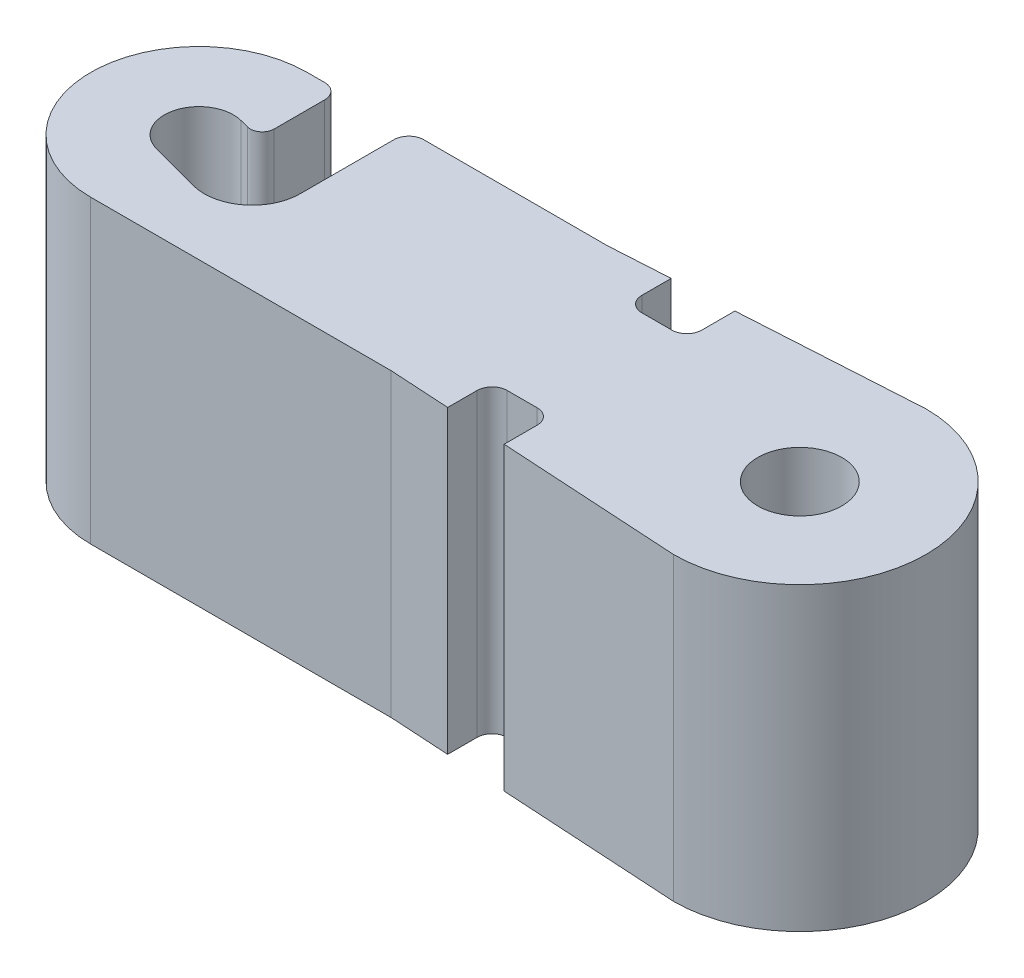
ISO-10303-21;
HEADER;
FILE_DESCRIPTION(('STEP AP214'),'2;1');
FILE_NAME('part.step','',(''),(''),'','','');
FILE_SCHEMA(('AUTOMOTIVE_DESIGN { 1 0 10303 214 1 1 1 1 }'));
ENDSEC;
DATA;
#1=APPLICATION_CONTEXT('core data for automotive mechanical design processes');
#2=APPLICATION_PROTOCOL_DEFINITION('international standard','automotive_design',2000,#1);
#3=PRODUCT_CONTEXT('',#1,'mechanical');
#4=PRODUCT('Part','Part','',(#3));
#5=PRODUCT_RELATED_PRODUCT_CATEGORY('part','',(#4));
#6=PRODUCT_DEFINITION_FORMATION('','',#4);
#7=PRODUCT_DEFINITION_CONTEXT('part definition',#1,'design');
#8=PRODUCT_DEFINITION('design','',#6,#7);
#9=PRODUCT_DEFINITION_SHAPE('','',#8);
#10=(LENGTH_UNIT() NAMED_UNIT(*) SI_UNIT(.MILLI.,.METRE.));
#11=(NAMED_UNIT(*) PLANE_ANGLE_UNIT() SI_UNIT($,.RADIAN.));
#12=(NAMED_UNIT(*) SI_UNIT($,.STERADIAN.) SOLID_ANGLE_UNIT());
#13=UNCERTAINTY_MEASURE_WITH_UNIT(LENGTH_MEASURE(1.E-05),#10,'distance_accuracy_value','');
#14=(GEOMETRIC_REPRESENTATION_CONTEXT(3) GLOBAL_UNCERTAINTY_ASSIGNED_CONTEXT((#13)) GLOBAL_UNIT_ASSIGNED_CONTEXT((#10,
#11,#12)) REPRESENTATION_CONTEXT('',''));
#15=CARTESIAN_POINT('',(0.,0.,0.));
#16=DIRECTION('',(0.,0.,1.));
#17=DIRECTION('',(1.,0.,0.));
#18=AXIS2_PLACEMENT_3D('',#15,#16,#17);
#19=CARTESIAN_POINT('',(-2.50000000000002,2.5,-0.9));
#20=DIRECTION('',(0.,0.,1.));
#21=DIRECTION('',(1.,0.,0.));
#22=AXIS2_PLACEMENT_3D('',#19,#20,#21);
#23=PLANE('',#22);
#24=DIRECTION('',(-1.,0.,0.));
#25=VECTOR('',#24,1.);
#26=CARTESIAN_POINT('',(-2.50000000000002,2.5,-0.9));
#27=LINE('',#26,#25);
#28=CARTESIAN_POINT('',(-4.85337914702339,2.5,-0.9));
#29=VERTEX_POINT('',#28);
#30=CARTESIAN_POINT('',(-5.,2.5,-0.9));
#31=VERTEX_POINT('',#30);
#32=EDGE_CURVE('E302',#29,#31,#27,.T.);
#33=ORIENTED_EDGE('',*,*,#32,.F.);
#34=DIRECTION('',(0.,1.,0.));
#35=VECTOR('',#34,1.);
#36=CARTESIAN_POINT('',(-4.85337914702339,2.5,-0.9));
#37=LINE('',#36,#35);
#38=CARTESIAN_POINT('',(-4.85337914702339,0.,-0.9));
#39=VERTEX_POINT('',#38);
#40=EDGE_CURVE('E378',#29,#39,#37,.F.);
#41=ORIENTED_EDGE('',*,*,#40,.T.);
#42=DIRECTION('',(-1.,0.,0.));
#43=VECTOR('',#42,1.);
#44=CARTESIAN_POINT('',(-2.50000000000002,0.,-0.9));
#45=LINE('',#44,#43);
#46=CARTESIAN_POINT('',(-5.,0.,-0.9));
#47=VERTEX_POINT('',#46);
#48=EDGE_CURVE('E345',#39,#47,#45,.T.);
#49=ORIENTED_EDGE('',*,*,#48,.T.);
#50=DIRECTION('',(0.,-1.,0.));
#51=VECTOR('',#50,1.);
#52=CARTESIAN_POINT('',(-5.,2.5,-0.9));
#53=LINE('',#52,#51);
#54=EDGE_CURVE('E351',#31,#47,#53,.T.);
#55=ORIENTED_EDGE('',*,*,#54,.F.);
#56=EDGE_LOOP('',(#33,#41,#49,#55));
#57=FACE_BOUND('',#56,.T.);
#58=ADVANCED_FACE('F35',(#57),#23,.F.);
#59=CARTESIAN_POINT('',(-2.50000000000002,2.5,-0.9));
#60=DIRECTION('',(-0.0598922907279451,0.,-0.998204845465779));
#61=DIRECTION('',(-0.998204845465779,0.,0.0598922907279451));
#62=AXIS2_PLACEMENT_3D('',#59,#60,#61);
#63=PLANE('',#62);
#64=DIRECTION('',(0.998204845465779,0.,-0.0598922907279451));
#65=VECTOR('',#64,1.);
#66=CARTESIAN_POINT('',(-2.50000000000002,0.,-0.9));
#67=LINE('',#66,#65);
#68=CARTESIAN_POINT('',(-2.50000000000002,0.,-0.9));
#69=VERTEX_POINT('',#68);
#70=CARTESIAN_POINT('',(-2.,0.,-0.93));
#71=VERTEX_POINT('',#70);
#72=EDGE_CURVE('E307',#69,#71,#67,.T.);
#73=ORIENTED_EDGE('',*,*,#72,.F.);
#74=DIRECTION('',(0.,-1.,0.));
#75=VECTOR('',#74,1.);
#76=CARTESIAN_POINT('',(-2.50000000000002,2.5,-0.9));
#77=LINE('',#76,#75);
#78=CARTESIAN_POINT('',(-2.50000000000002,2.5,-0.9));
#79=VERTEX_POINT('',#78);
#80=EDGE_CURVE('E348',#79,#69,#77,.T.);
#81=ORIENTED_EDGE('',*,*,#80,.F.);
#82=DIRECTION('',(0.998204845465779,0.,-0.0598922907279451));
#83=VECTOR('',#82,1.);
#84=CARTESIAN_POINT('',(-2.50000000000002,2.5,-0.9));
#85=LINE('',#84,#83);
#86=CARTESIAN_POINT('',(-2.,2.5,-0.93));
#87=VERTEX_POINT('',#86);
#88=EDGE_CURVE('E265',#79,#87,#85,.T.);
#89=ORIENTED_EDGE('',*,*,#88,.T.);
#90=DIRECTION('',(0.,-1.,0.));
#91=VECTOR('',#90,1.);
#92=CARTESIAN_POINT('',(-2.,2.5,-0.93));
#93=LINE('',#92,#91);
#94=EDGE_CURVE('E306',#87,#71,#93,.T.);
#95=ORIENTED_EDGE('',*,*,#94,.T.);
#96=EDGE_LOOP('',(#73,#81,#89,#95));
#97=FACE_BOUND('',#96,.T.);
#98=ADVANCED_FACE('F462',(#97),#63,.T.);
#99=CARTESIAN_POINT('',(-4.02837914702339,0.,-0.9));
#100=VERTEX_POINT('',#99);
#101=EDGE_CURVE('E269',#69,#100,#45,.T.);
#102=ORIENTED_EDGE('',*,*,#101,.T.);
#103=DIRECTION('',(0.,1.,0.));
#104=VECTOR('',#103,1.);
#105=CARTESIAN_POINT('',(-4.02837914702339,2.5,-0.9));
#106=LINE('',#105,#104);
#107=CARTESIAN_POINT('',(-4.02837914702339,2.5,-0.9));
#108=VERTEX_POINT('',#107);
#109=EDGE_CURVE('E384',#100,#108,#106,.T.);
#110=ORIENTED_EDGE('',*,*,#109,.T.);
#111=EDGE_CURVE('E303',#79,#108,#27,.T.);
#112=ORIENTED_EDGE('',*,*,#111,.F.);
#113=ORIENTED_EDGE('',*,*,#80,.T.);
#114=EDGE_LOOP('',(#102,#110,#112,#113));
#115=FACE_BOUND('',#114,.T.);
#116=ADVANCED_FACE('F458',(#115),#23,.F.);
#117=CARTESIAN_POINT('',(-5.,2.5,0.));
#118=DIRECTION('',(0.,-1.,0.));
#119=DIRECTION('',(0.,0.,-1.));
#120=AXIS2_PLACEMENT_3D('',#117,#118,#119);
#121=CYLINDRICAL_SURFACE('',#120,0.9);
#122=CARTESIAN_POINT('',(-5.,0.,0.));
#123=DIRECTION('',(0.,1.,0.));
#124=DIRECTION('',(0.,0.,1.));
#125=AXIS2_PLACEMENT_3D('',#122,#123,#124);
#126=CIRCLE('',#125,0.9);
#127=CARTESIAN_POINT('',(-5.,0.,0.9));
#128=VERTEX_POINT('',#127);
#129=EDGE_CURVE('E342',#47,#128,#126,.T.);
#130=ORIENTED_EDGE('',*,*,#129,.T.);
#131=DIRECTION('',(0.,-1.,0.));
#132=VECTOR('',#131,1.);
#133=CARTESIAN_POINT('',(-5.,2.5,0.9));
#134=LINE('',#133,#132);
#135=CARTESIAN_POINT('',(-5.,2.5,0.9));
#136=VERTEX_POINT('',#135);
#137=EDGE_CURVE('E354',#136,#128,#134,.T.);
#138=ORIENTED_EDGE('',*,*,#137,.F.);
#139=CARTESIAN_POINT('',(-5.,2.5,0.));
#140=DIRECTION('',(0.,1.,0.));
#141=DIRECTION('',(0.,0.,1.));
#142=AXIS2_PLACEMENT_3D('',#139,#140,#141);
#143=CIRCLE('',#142,0.9);
#144=EDGE_CURVE('E300',#31,#136,#143,.T.);
#145=ORIENTED_EDGE('',*,*,#144,.F.);
#146=ORIENTED_EDGE('',*,*,#54,.T.);
#147=EDGE_LOOP('',(#130,#138,#145,#146));
#148=FACE_BOUND('',#147,.T.);
#149=ADVANCED_FACE('F533',(#148),#121,.T.);
#150=CARTESIAN_POINT('',(-2.50000000000002,2.5,0.9));
#151=DIRECTION('',(0.,0.,1.));
#152=DIRECTION('',(1.,0.,0.));
#153=AXIS2_PLACEMENT_3D('',#150,#151,#152);
#154=PLANE('',#153);
#155=DIRECTION('',(-1.,0.,0.));
#156=VECTOR('',#155,1.);
#157=CARTESIAN_POINT('',(-2.50000000000002,0.,0.9));
#158=LINE('',#157,#156);
#159=CARTESIAN_POINT('',(-2.50000000000002,0.,0.9));
#160=VERTEX_POINT('',#159);
#161=EDGE_CURVE('E339',#160,#128,#158,.T.);
#162=ORIENTED_EDGE('',*,*,#161,.F.);
#163=DIRECTION('',(0.,-1.,0.));
#164=VECTOR('',#163,1.);
#165=CARTESIAN_POINT('',(-2.50000000000002,2.5,0.9));
#166=LINE('',#165,#164);
#167=CARTESIAN_POINT('',(-2.50000000000002,2.5,0.9));
#168=VERTEX_POINT('',#167);
#169=EDGE_CURVE('E356',#168,#160,#166,.T.);
#170=ORIENTED_EDGE('',*,*,#169,.F.);
#171=DIRECTION('',(-1.,0.,0.));
#172=VECTOR('',#171,1.);
#173=CARTESIAN_POINT('',(-2.50000000000002,2.5,0.9));
#174=LINE('',#173,#172);
#175=EDGE_CURVE('E297',#168,#136,#174,.T.);
#176=ORIENTED_EDGE('',*,*,#175,.T.);
#177=ORIENTED_EDGE('',*,*,#137,.T.);
#178=EDGE_LOOP('',(#162,#170,#176,#177));
#179=FACE_BOUND('',#178,.T.);
#180=ADVANCED_FACE('F529',(#179),#154,.T.);
#181=CARTESIAN_POINT('',(-2.50000000000002,2.5,0.9));
#182=DIRECTION('',(0.0598922907279451,0.,-0.998204845465779));
#183=DIRECTION('',(-0.998204845465779,0.,-0.0598922907279451));
#184=AXIS2_PLACEMENT_3D('',#181,#182,#183);
#185=PLANE('',#184);
#186=DIRECTION('',(0.998204845465779,0.,0.0598922907279451));
#187=VECTOR('',#186,1.);
#188=CARTESIAN_POINT('',(-2.50000000000002,0.,0.9));
#189=LINE('',#188,#187);
#190=CARTESIAN_POINT('',(-2.,0.,0.93));
#191=VERTEX_POINT('',#190);
#192=EDGE_CURVE('E337',#160,#191,#189,.T.);
#193=ORIENTED_EDGE('',*,*,#192,.T.);
#194=DIRECTION('',(0.,-1.,0.));
#195=VECTOR('',#194,1.);
#196=CARTESIAN_POINT('',(-2.,2.5,0.93));
#197=LINE('',#196,#195);
#198=CARTESIAN_POINT('',(-2.,2.5,0.93));
#199=VERTEX_POINT('',#198);
#200=EDGE_CURVE('E358',#199,#191,#197,.T.);
#201=ORIENTED_EDGE('',*,*,#200,.F.);
#202=DIRECTION('',(0.998204845465779,0.,0.0598922907279451));
#203=VECTOR('',#202,1.);
#204=CARTESIAN_POINT('',(-2.50000000000002,2.5,0.9));
#205=LINE('',#204,#203);
#206=EDGE_CURVE('E295',#168,#199,#205,.T.);
#207=ORIENTED_EDGE('',*,*,#206,.F.);
#208=ORIENTED_EDGE('',*,*,#169,.T.);
#209=EDGE_LOOP('',(#193,#201,#207,#208));
#210=FACE_BOUND('',#209,.T.);
#211=ADVANCED_FACE('F524',(#210),#185,.F.);
#212=CARTESIAN_POINT('',(-2.,2.5,0.93));
#213=DIRECTION('',(-1.,0.,0.));
#214=DIRECTION('',(0.,0.,1.));
#215=AXIS2_PLACEMENT_3D('',#212,#213,#214);
#216=PLANE('',#215);
#217=DIRECTION('',(0.,0.,-1.));
#218=VECTOR('',#217,1.);
#219=CARTESIAN_POINT('',(-2.,0.,0.93));
#220=LINE('',#219,#218);
#221=CARTESIAN_POINT('',(-2.,0.,0.685));
#222=VERTEX_POINT('',#221);
#223=EDGE_CURVE('E334',#191,#222,#220,.T.);
#224=ORIENTED_EDGE('',*,*,#223,.T.);
#225=DIRECTION('',(0.,-1.,0.));
#226=VECTOR('',#225,1.);
#227=CARTESIAN_POINT('',(-2.,2.5,0.685));
#228=LINE('',#227,#226);
#229=CARTESIAN_POINT('',(-2.,2.5,0.685));
#230=VERTEX_POINT('',#229);
#231=EDGE_CURVE('E395',#222,#230,#228,.F.);
#232=ORIENTED_EDGE('',*,*,#231,.T.);
#233=DIRECTION('',(0.,0.,-1.));
#234=VECTOR('',#233,1.);
#235=CARTESIAN_POINT('',(-2.,2.5,0.93));
#236=LINE('',#235,#234);
#237=EDGE_CURVE('E292',#199,#230,#236,.T.);
#238=ORIENTED_EDGE('',*,*,#237,.F.);
#239=ORIENTED_EDGE('',*,*,#200,.T.);
#240=EDGE_LOOP('',(#224,#232,#238,#239));
#241=FACE_BOUND('',#240,.T.);
#242=ADVANCED_FACE('F519',(#241),#216,.F.);
#243=CARTESIAN_POINT('',(-1.5,2.5,0.56));
#244=DIRECTION('',(0.,0.,1.));
#245=DIRECTION('',(1.,0.,0.));
#246=AXIS2_PLACEMENT_3D('',#243,#244,#245);
#247=PLANE('',#246);
#248=DIRECTION('',(-1.,0.,0.));
#249=VECTOR('',#248,1.);
#250=CARTESIAN_POINT('',(-1.5,2.5,0.56));
#251=LINE('',#250,#249);
#252=CARTESIAN_POINT('',(-1.625,2.5,0.56));
#253=VERTEX_POINT('',#252);
#254=CARTESIAN_POINT('',(-1.875,2.5,0.56));
#255=VERTEX_POINT('',#254);
#256=EDGE_CURVE('E289',#253,#255,#251,.T.);
#257=ORIENTED_EDGE('',*,*,#256,.T.);
#258=DIRECTION('',(0.,-1.,0.));
#259=VECTOR('',#258,1.);
#260=CARTESIAN_POINT('',(-1.875,2.5,0.56));
#261=LINE('',#260,#259);
#262=CARTESIAN_POINT('',(-1.875,0.,0.56));
#263=VERTEX_POINT('',#262);
#264=EDGE_CURVE('E392',#255,#263,#261,.T.);
#265=ORIENTED_EDGE('',*,*,#264,.T.);
#266=DIRECTION('',(-1.,0.,0.));
#267=VECTOR('',#266,1.);
#268=CARTESIAN_POINT('',(-1.5,0.,0.56));
#269=LINE('',#268,#267);
#270=CARTESIAN_POINT('',(-1.625,0.,0.56));
#271=VERTEX_POINT('',#270);
#272=EDGE_CURVE('E331',#271,#263,#269,.T.);
#273=ORIENTED_EDGE('',*,*,#272,.F.);
#274=DIRECTION('',(0.,-1.,0.));
#275=VECTOR('',#274,1.);
#276=CARTESIAN_POINT('',(-1.625,2.5,0.56));
#277=LINE('',#276,#275);
#278=EDGE_CURVE('E390',#271,#253,#277,.F.);
#279=ORIENTED_EDGE('',*,*,#278,.T.);
#280=EDGE_LOOP('',(#257,#265,#273,#279));
#281=FACE_BOUND('',#280,.T.);
#282=ADVANCED_FACE('F507',(#281),#247,.T.);
#283=CARTESIAN_POINT('',(-1.5,2.5,0.56));
#284=DIRECTION('',(1.,0.,0.));
#285=DIRECTION('',(0.,0.,-1.));
#286=AXIS2_PLACEMENT_3D('',#283,#284,#285);
#287=PLANE('',#286);
#288=DIRECTION('',(0.,0.,1.));
#289=VECTOR('',#288,1.);
#290=CARTESIAN_POINT('',(-1.5,2.5,0.56));
#291=LINE('',#290,#289);
#292=CARTESIAN_POINT('',(-1.5,2.5,0.685));
#293=VERTEX_POINT('',#292);
#294=CARTESIAN_POINT('',(-1.5,2.5,0.96));
#295=VERTEX_POINT('',#294);
#296=EDGE_CURVE('E287',#293,#295,#291,.T.);
#297=ORIENTED_EDGE('',*,*,#296,.F.);
#298=DIRECTION('',(0.,-1.,0.));
#299=VECTOR('',#298,1.);
#300=CARTESIAN_POINT('',(-1.5,2.5,0.685));
#301=LINE('',#300,#299);
#302=CARTESIAN_POINT('',(-1.5,0.,0.685));
#303=VERTEX_POINT('',#302);
#304=EDGE_CURVE('E397',#293,#303,#301,.T.);
#305=ORIENTED_EDGE('',*,*,#304,.T.);
#306=DIRECTION('',(0.,0.,1.));
#307=VECTOR('',#306,1.);
#308=CARTESIAN_POINT('',(-1.5,0.,0.56));
#309=LINE('',#308,#307);
#310=CARTESIAN_POINT('',(-1.5,0.,0.96));
#311=VERTEX_POINT('',#310);
#312=EDGE_CURVE('E329',#303,#311,#309,.T.);
#313=ORIENTED_EDGE('',*,*,#312,.T.);
#314=DIRECTION('',(0.,-1.,0.));
#315=VECTOR('',#314,1.);
#316=CARTESIAN_POINT('',(-1.5,2.5,0.96));
#317=LINE('',#316,#315);
#318=EDGE_CURVE('E361',#295,#311,#317,.T.);
#319=ORIENTED_EDGE('',*,*,#318,.F.);
#320=EDGE_LOOP('',(#297,#305,#313,#319));
#321=FACE_BOUND('',#320,.T.);
#322=ADVANCED_FACE('F501',(#321),#287,.F.);
#323=CARTESIAN_POINT('',(0.,2.5,1.05));
#324=DIRECTION('',(-0.0598922907279466,0.,0.998204845465779));
#325=DIRECTION('',(0.998204845465779,0.,0.0598922907279466));
#326=AXIS2_PLACEMENT_3D('',#323,#324,#325);
#327=PLANE('',#326);
#328=DIRECTION('',(-0.998204845465779,0.,-0.0598922907279466));
#329=VECTOR('',#328,1.);
#330=CARTESIAN_POINT('',(0.,0.,1.05));
#331=LINE('',#330,#329);
#332=CARTESIAN_POINT('',(0.,0.,1.05));
#333=VERTEX_POINT('',#332);
#334=EDGE_CURVE('E326',#333,#311,#331,.T.);
#335=ORIENTED_EDGE('',*,*,#334,.F.);
#336=DIRECTION('',(0.,-1.,0.));
#337=VECTOR('',#336,1.);
#338=CARTESIAN_POINT('',(0.,2.5,1.05));
#339=LINE('',#338,#337);
#340=CARTESIAN_POINT('',(0.,2.5,1.05));
#341=VERTEX_POINT('',#340);
#342=EDGE_CURVE('E364',#341,#333,#339,.T.);
#343=ORIENTED_EDGE('',*,*,#342,.F.);
#344=DIRECTION('',(-0.998204845465779,0.,-0.0598922907279466));
#345=VECTOR('',#344,1.);
#346=CARTESIAN_POINT('',(0.,2.5,1.05));
#347=LINE('',#346,#345);
#348=EDGE_CURVE('E284',#341,#295,#347,.T.);
#349=ORIENTED_EDGE('',*,*,#348,.T.);
#350=ORIENTED_EDGE('',*,*,#318,.T.);
#351=EDGE_LOOP('',(#335,#343,#349,#350));
#352=FACE_BOUND('',#351,.T.);
#353=ADVANCED_FACE('F497',(#352),#327,.T.);
#354=CARTESIAN_POINT('',(0.,2.5,0.));
#355=DIRECTION('',(0.,-1.,0.));
#356=DIRECTION('',(0.,0.,-1.));
#357=AXIS2_PLACEMENT_3D('',#354,#355,#356);
#358=CYLINDRICAL_SURFACE('',#357,1.05);
#359=CARTESIAN_POINT('',(0.,0.,0.));
#360=DIRECTION('',(0.,-1.,0.));
#361=DIRECTION('',(0.,0.,-1.));
#362=AXIS2_PLACEMENT_3D('',#359,#360,#361);
#363=CIRCLE('',#362,1.05);
#364=CARTESIAN_POINT('',(0.,0.,-1.05));
#365=VERTEX_POINT('',#364);
#366=EDGE_CURVE('E323',#365,#333,#363,.T.);
#367=ORIENTED_EDGE('',*,*,#366,.F.);
#368=DIRECTION('',(0.,-1.,0.));
#369=VECTOR('',#368,1.);
#370=CARTESIAN_POINT('',(0.,2.5,-1.05));
#371=LINE('',#370,#369);
#372=CARTESIAN_POINT('',(0.,2.5,-1.05));
#373=VERTEX_POINT('',#372);
#374=EDGE_CURVE('E366',#373,#365,#371,.T.);
#375=ORIENTED_EDGE('',*,*,#374,.F.);
#376=CARTESIAN_POINT('',(0.,2.5,0.));
#377=DIRECTION('',(0.,-1.,0.));
#378=DIRECTION('',(0.,0.,-1.));
#379=AXIS2_PLACEMENT_3D('',#376,#377,#378);
#380=CIRCLE('',#379,1.05);
#381=EDGE_CURVE('E281',#373,#341,#380,.T.);
#382=ORIENTED_EDGE('',*,*,#381,.T.);
#383=ORIENTED_EDGE('',*,*,#342,.T.);
#384=EDGE_LOOP('',(#367,#375,#382,#383));
#385=FACE_BOUND('',#384,.T.);
#386=ADVANCED_FACE('F493',(#385),#358,.T.);
#387=CARTESIAN_POINT('',(-1.5,2.5,-0.96));
#388=DIRECTION('',(-0.0598922907279466,0.,-0.998204845465779));
#389=DIRECTION('',(-0.998204845465779,0.,0.0598922907279466));
#390=AXIS2_PLACEMENT_3D('',#387,#388,#389);
#391=PLANE('',#390);
#392=DIRECTION('',(0.998204845465779,0.,-0.0598922907279466));
#393=VECTOR('',#392,1.);
#394=CARTESIAN_POINT('',(-1.5,0.,-0.96));
#395=LINE('',#394,#393);
#396=CARTESIAN_POINT('',(-1.5,0.,-0.96));
#397=VERTEX_POINT('',#396);
#398=EDGE_CURVE('E320',#397,#365,#395,.T.);
#399=ORIENTED_EDGE('',*,*,#398,.F.);
#400=DIRECTION('',(0.,-1.,0.));
#401=VECTOR('',#400,1.);
#402=CARTESIAN_POINT('',(-1.5,2.5,-0.96));
#403=LINE('',#402,#401);
#404=CARTESIAN_POINT('',(-1.5,2.5,-0.96));
#405=VERTEX_POINT('',#404);
#406=EDGE_CURVE('E368',#405,#397,#403,.T.);
#407=ORIENTED_EDGE('',*,*,#406,.F.);
#408=DIRECTION('',(0.998204845465779,0.,-0.0598922907279466));
#409=VECTOR('',#408,1.);
#410=CARTESIAN_POINT('',(-1.5,2.5,-0.96));
#411=LINE('',#410,#409);
#412=EDGE_CURVE('E278',#405,#373,#411,.T.);
#413=ORIENTED_EDGE('',*,*,#412,.T.);
#414=ORIENTED_EDGE('',*,*,#374,.T.);
#415=EDGE_LOOP('',(#399,#407,#413,#414));
#416=FACE_BOUND('',#415,.T.);
#417=ADVANCED_FACE('F488',(#416),#391,.T.);
#418=CARTESIAN_POINT('',(-1.5,2.5,-0.96));
#419=DIRECTION('',(1.,0.,0.));
#420=DIRECTION('',(0.,0.,-1.));
#421=AXIS2_PLACEMENT_3D('',#418,#419,#420);
#422=PLANE('',#421);
#423=DIRECTION('',(0.,0.,1.));
#424=VECTOR('',#423,1.);
#425=CARTESIAN_POINT('',(-1.5,0.,-0.96));
#426=LINE('',#425,#424);
#427=CARTESIAN_POINT('',(-1.5,0.,-0.685));
#428=VERTEX_POINT('',#427);
#429=EDGE_CURVE('E317',#397,#428,#426,.T.);
#430=ORIENTED_EDGE('',*,*,#429,.T.);
#431=DIRECTION('',(0.,-1.,0.));
#432=VECTOR('',#431,1.);
#433=CARTESIAN_POINT('',(-1.5,2.5,-0.685));
#434=LINE('',#433,#432);
#435=CARTESIAN_POINT('',(-1.5,2.5,-0.685));
#436=VERTEX_POINT('',#435);
#437=EDGE_CURVE('E405',#428,#436,#434,.F.);
#438=ORIENTED_EDGE('',*,*,#437,.T.);
#439=DIRECTION('',(0.,0.,1.));
#440=VECTOR('',#439,1.);
#441=CARTESIAN_POINT('',(-1.5,2.5,-0.96));
#442=LINE('',#441,#440);
#443=EDGE_CURVE('E275',#405,#436,#442,.T.);
#444=ORIENTED_EDGE('',*,*,#443,.F.);
#445=ORIENTED_EDGE('',*,*,#406,.T.);
#446=EDGE_LOOP('',(#430,#438,#444,#445));
#447=FACE_BOUND('',#446,.T.);
#448=ADVANCED_FACE('F486',(#447),#422,.F.);
#449=CARTESIAN_POINT('',(-2.,2.5,-0.56));
#450=DIRECTION('',(0.,0.,-1.));
#451=DIRECTION('',(-1.,0.,0.));
#452=AXIS2_PLACEMENT_3D('',#449,#450,#451);
#453=PLANE('',#452);
#454=DIRECTION('',(1.,0.,0.));
#455=VECTOR('',#454,1.);
#456=CARTESIAN_POINT('',(-2.,2.5,-0.56));
#457=LINE('',#456,#455);
#458=CARTESIAN_POINT('',(-1.875,2.5,-0.56));
#459=VERTEX_POINT('',#458);
#460=CARTESIAN_POINT('',(-1.625,2.5,-0.56));
#461=VERTEX_POINT('',#460);
#462=EDGE_CURVE('E272',#459,#461,#457,.T.);
#463=ORIENTED_EDGE('',*,*,#462,.T.);
#464=DIRECTION('',(0.,-1.,0.));
#465=VECTOR('',#464,1.);
#466=CARTESIAN_POINT('',(-1.625,2.5,-0.56));
#467=LINE('',#466,#465);
#468=CARTESIAN_POINT('',(-1.625,0.,-0.56));
#469=VERTEX_POINT('',#468);
#470=EDGE_CURVE('E402',#461,#469,#467,.T.);
#471=ORIENTED_EDGE('',*,*,#470,.T.);
#472=DIRECTION('',(1.,0.,0.));
#473=VECTOR('',#472,1.);
#474=CARTESIAN_POINT('',(-2.,0.,-0.56));
#475=LINE('',#474,#473);
#476=CARTESIAN_POINT('',(-1.875,0.,-0.56));
#477=VERTEX_POINT('',#476);
#478=EDGE_CURVE('E314',#477,#469,#475,.T.);
#479=ORIENTED_EDGE('',*,*,#478,.F.);
#480=DIRECTION('',(0.,-1.,0.));
#481=VECTOR('',#480,1.);
#482=CARTESIAN_POINT('',(-1.875,2.5,-0.56));
#483=LINE('',#482,#481);
#484=EDGE_CURVE('E400',#477,#459,#483,.F.);
#485=ORIENTED_EDGE('',*,*,#484,.T.);
#486=EDGE_LOOP('',(#463,#471,#479,#485));
#487=FACE_BOUND('',#486,.T.);
#488=ADVANCED_FACE('F475',(#487),#453,.T.);
#489=CARTESIAN_POINT('',(-2.,2.5,-0.93));
#490=DIRECTION('',(1.,0.,0.));
#491=DIRECTION('',(0.,0.,-1.));
#492=AXIS2_PLACEMENT_3D('',#489,#490,#491);
#493=PLANE('',#492);
#494=DIRECTION('',(0.,0.,1.));
#495=VECTOR('',#494,1.);
#496=CARTESIAN_POINT('',(-2.,2.5,-0.93));
#497=LINE('',#496,#495);
#498=CARTESIAN_POINT('',(-2.,2.5,-0.685));
#499=VERTEX_POINT('',#498);
#500=EDGE_CURVE('E268',#87,#499,#497,.T.);
#501=ORIENTED_EDGE('',*,*,#500,.T.);
#502=DIRECTION('',(0.,-1.,0.));
#503=VECTOR('',#502,1.);
#504=CARTESIAN_POINT('',(-2.,0.,-0.685));
#505=LINE('',#504,#503);
#506=CARTESIAN_POINT('',(-2.,0.,-0.685));
#507=VERTEX_POINT('',#506);
#508=EDGE_CURVE('E407',#499,#507,#505,.T.);
#509=ORIENTED_EDGE('',*,*,#508,.T.);
#510=DIRECTION('',(0.,0.,1.));
#511=VECTOR('',#510,1.);
#512=CARTESIAN_POINT('',(-2.,0.,-0.93));
#513=LINE('',#512,#511);
#514=EDGE_CURVE('E310',#71,#507,#513,.T.);
#515=ORIENTED_EDGE('',*,*,#514,.F.);
#516=ORIENTED_EDGE('',*,*,#94,.F.);
#517=EDGE_LOOP('',(#501,#509,#515,#516));
#518=FACE_BOUND('',#517,.T.);
#519=ADVANCED_FACE('F466',(#518),#493,.T.);
#520=CARTESIAN_POINT('',(0.,2.5,0.));
#521=DIRECTION('',(0.,-1.,0.));
#522=DIRECTION('',(0.,0.,-1.));
#523=AXIS2_PLACEMENT_3D('',#520,#521,#522);
#524=PLANE('',#523);
#525=CARTESIAN_POINT('',(0.,2.5,0.));
#526=DIRECTION('',(0.,1.,0.));
#527=DIRECTION('',(0.,0.,1.));
#528=AXIS2_PLACEMENT_3D('',#525,#526,#527);
#529=CIRCLE('',#528,0.35);
#530=CARTESIAN_POINT('',(0.,2.5,0.35));
#531=VERTEX_POINT('',#530);
#532=EDGE_CURVE('E251',#531,#531,#529,.T.);
#533=ORIENTED_EDGE('',*,*,#532,.F.);
#534=EDGE_LOOP('',(#533));
#535=FACE_BOUND('',#534,.T.);
#536=DIRECTION('',(-0.965925826289066,0.,-0.258819045102529));
#537=VECTOR('',#536,1.);
#538=CARTESIAN_POINT('',(-4.92558952453303,2.5,-0.277703675058107));
#539=LINE('',#538,#537);
#540=CARTESIAN_POINT('',(-4.85426105153365,2.5,-0.258591268320578));
#541=VERTEX_POINT('',#540);
#542=CARTESIAN_POINT('',(-4.92558952453303,2.5,-0.277703675058107));
#543=VERTEX_POINT('',#542);
#544=EDGE_CURVE('E246',#541,#543,#539,.T.);
#545=ORIENTED_EDGE('',*,*,#544,.F.);
#546=CARTESIAN_POINT('',(-4.82837914702339,2.5,-0.355183850949484));
#547=DIRECTION('',(0.,-1.,0.));
#548=DIRECTION('',(0.,0.,-1.));
#549=AXIS2_PLACEMENT_3D('',#546,#547,#548);
#550=CIRCLE('',#549,0.1);
#551=CARTESIAN_POINT('',(-4.72837914702339,2.5,-0.355183850949484));
#552=VERTEX_POINT('',#551);
#553=EDGE_CURVE('E57',#541,#552,#550,.F.);
#554=ORIENTED_EDGE('',*,*,#553,.T.);
#555=DIRECTION('',(0.,0.,1.));
#556=VECTOR('',#555,1.);
#557=CARTESIAN_POINT('',(-4.72837914702339,2.5,-0.9));
#558=LINE('',#557,#556);
#559=CARTESIAN_POINT('',(-4.72837914702339,2.5,-0.775));
#560=VERTEX_POINT('',#559);
#561=EDGE_CURVE('E248',#560,#552,#558,.T.);
#562=ORIENTED_EDGE('',*,*,#561,.F.);
#563=CARTESIAN_POINT('',(-4.85337914702339,2.5,-0.775));
#564=DIRECTION('',(0.,-1.,0.));
#565=DIRECTION('',(0.,0.,-1.));
#566=AXIS2_PLACEMENT_3D('',#563,#564,#565);
#567=CIRCLE('',#566,0.125);
#568=EDGE_CURVE('E376',#560,#29,#567,.F.);
#569=ORIENTED_EDGE('',*,*,#568,.T.);
#570=ORIENTED_EDGE('',*,*,#32,.T.);
#571=ORIENTED_EDGE('',*,*,#144,.T.);
#572=ORIENTED_EDGE('',*,*,#175,.F.);
#573=ORIENTED_EDGE('',*,*,#206,.T.);
#574=ORIENTED_EDGE('',*,*,#237,.T.);
#575=CARTESIAN_POINT('',(-1.875,2.5,0.685));
#576=DIRECTION('',(0.,-1.,0.));
#577=DIRECTION('',(0.,0.,-1.));
#578=AXIS2_PLACEMENT_3D('',#575,#576,#577);
#579=CIRCLE('',#578,0.125);
#580=EDGE_CURVE('E412',#230,#255,#579,.T.);
#581=ORIENTED_EDGE('',*,*,#580,.T.);
#582=ORIENTED_EDGE('',*,*,#256,.F.);
#583=CARTESIAN_POINT('',(-1.625,2.5,0.685));
#584=DIRECTION('',(0.,-1.,0.));
#585=DIRECTION('',(0.,0.,-1.));
#586=AXIS2_PLACEMENT_3D('',#583,#584,#585);
#587=CIRCLE('',#586,0.125);
#588=EDGE_CURVE('E416',#253,#293,#587,.T.);
#589=ORIENTED_EDGE('',*,*,#588,.T.);
#590=ORIENTED_EDGE('',*,*,#296,.T.);
#591=ORIENTED_EDGE('',*,*,#348,.F.);
#592=ORIENTED_EDGE('',*,*,#381,.F.);
#593=ORIENTED_EDGE('',*,*,#412,.F.);
#594=ORIENTED_EDGE('',*,*,#443,.T.);
#595=CARTESIAN_POINT('',(-1.625,2.5,-0.685));
#596=DIRECTION('',(0.,-1.,0.));
#597=DIRECTION('',(0.,0.,-1.));
#598=AXIS2_PLACEMENT_3D('',#595,#596,#597);
#599=CIRCLE('',#598,0.125);
#600=EDGE_CURVE('E420',#436,#461,#599,.T.);
#601=ORIENTED_EDGE('',*,*,#600,.T.);
#602=ORIENTED_EDGE('',*,*,#462,.F.);
#603=CARTESIAN_POINT('',(-1.875,2.5,-0.685));
#604=DIRECTION('',(0.,-1.,0.));
#605=DIRECTION('',(0.,0.,-1.));
#606=AXIS2_PLACEMENT_3D('',#603,#604,#605);
#607=CIRCLE('',#606,0.125);
#608=EDGE_CURVE('E424',#459,#499,#607,.T.);
#609=ORIENTED_EDGE('',*,*,#608,.T.);
#610=ORIENTED_EDGE('',*,*,#500,.F.);
#611=ORIENTED_EDGE('',*,*,#88,.F.);
#612=ORIENTED_EDGE('',*,*,#111,.T.);
#613=CARTESIAN_POINT('',(-4.02837914702339,2.5,-0.775));
#614=DIRECTION('',(0.,-1.,0.));
#615=DIRECTION('',(0.,0.,-1.));
#616=AXIS2_PLACEMENT_3D('',#613,#614,#615);
#617=CIRCLE('',#616,0.125);
#618=CARTESIAN_POINT('',(-4.15337914702339,2.5,-0.775));
#619=VERTEX_POINT('',#618);
#620=EDGE_CURVE('E373',#108,#619,#617,.F.);
#621=ORIENTED_EDGE('',*,*,#620,.T.);
#622=DIRECTION('',(0.,0.,-1.));
#623=VECTOR('',#622,1.);
#624=CARTESIAN_POINT('',(-4.15337914702339,2.5,-0.9));
#625=LINE('',#624,#623);
#626=CARTESIAN_POINT('',(-4.15337914702339,2.5,0.00320312658184973));
#627=VERTEX_POINT('',#626);
#628=EDGE_CURVE('E261',#627,#619,#625,.T.);
#629=ORIENTED_EDGE('',*,*,#628,.F.);
#630=CARTESIAN_POINT('',(-4.55337914702339,2.5,0.00320312658184994));
#631=DIRECTION('',(0.,-1.,0.));
#632=DIRECTION('',(0.,0.,-1.));
#633=AXIS2_PLACEMENT_3D('',#630,#631,#632);
#634=CIRCLE('',#633,0.4);
#635=CARTESIAN_POINT('',(-4.6569067650644,2.5,0.389573457097477));
#636=VERTEX_POINT('',#635);
#637=EDGE_CURVE('E430',#627,#636,#634,.T.);
#638=ORIENTED_EDGE('',*,*,#637,.T.);
#639=DIRECTION('',(0.965925826289066,0.,0.258819045102528));
#640=VECTOR('',#639,1.);
#641=CARTESIAN_POINT('',(-5.07441047546698,2.5,0.277703675058106));
#642=LINE('',#641,#640);
#643=CARTESIAN_POINT('',(-5.07441047546698,2.5,0.277703675058106));
#644=VERTEX_POINT('',#643);
#645=EDGE_CURVE('E259',#644,#636,#642,.T.);
#646=ORIENTED_EDGE('',*,*,#645,.F.);
#647=CARTESIAN_POINT('',(-5.,2.5,0.));
#648=DIRECTION('',(0.,1.,0.));
#649=DIRECTION('',(0.,0.,1.));
#650=AXIS2_PLACEMENT_3D('',#647,#648,#649);
#651=CIRCLE('',#650,0.2875);
#652=EDGE_CURVE('E227',#543,#644,#651,.T.);
#653=ORIENTED_EDGE('',*,*,#652,.F.);
#654=EDGE_LOOP('',(#545,#554,#562,#569,#570,#571,#572,#573,#574,#581,#582,#589,#590,#591,#592,
#593,#594,#601,#602,#609,#610,#611,#612,#621,#629,#638,#646,#653));
#655=FACE_BOUND('',#654,.T.);
#656=ADVANCED_FACE('F442',(#535,#655),#524,.F.);
#657=CARTESIAN_POINT('',(0.,0.,0.));
#658=DIRECTION('',(0.,-1.,0.));
#659=DIRECTION('',(0.,0.,-1.));
#660=AXIS2_PLACEMENT_3D('',#657,#658,#659);
#661=PLANE('',#660);
#662=CARTESIAN_POINT('',(0.,0.,0.));
#663=DIRECTION('',(0.,1.,0.));
#664=DIRECTION('',(0.,0.,1.));
#665=AXIS2_PLACEMENT_3D('',#662,#663,#664);
#666=CIRCLE('',#665,0.35);
#667=CARTESIAN_POINT('',(0.,0.,0.35));
#668=VERTEX_POINT('',#667);
#669=EDGE_CURVE('E311',#668,#668,#666,.T.);
#670=ORIENTED_EDGE('',*,*,#669,.T.);
#671=EDGE_LOOP('',(#670));
#672=FACE_BOUND('',#671,.T.);
#673=DIRECTION('',(0.,0.,1.));
#674=VECTOR('',#673,1.);
#675=CARTESIAN_POINT('',(-4.72837914702339,0.,-0.9));
#676=LINE('',#675,#674);
#677=CARTESIAN_POINT('',(-4.72837914702339,0.,-0.775));
#678=VERTEX_POINT('',#677);
#679=CARTESIAN_POINT('',(-4.72837914702339,0.,-0.355183850949484));
#680=VERTEX_POINT('',#679);
#681=EDGE_CURVE('E255',#678,#680,#676,.T.);
#682=ORIENTED_EDGE('',*,*,#681,.T.);
#683=CARTESIAN_POINT('',(-4.82837914702339,0.,-0.355183850949484));
#684=DIRECTION('',(0.,-1.,0.));
#685=DIRECTION('',(0.,0.,-1.));
#686=AXIS2_PLACEMENT_3D('',#683,#684,#685);
#687=CIRCLE('',#686,0.1);
#688=CARTESIAN_POINT('',(-4.85426105153365,0.,-0.258591268320578));
#689=VERTEX_POINT('',#688);
#690=EDGE_CURVE('E11',#680,#689,#687,.T.);
#691=ORIENTED_EDGE('',*,*,#690,.T.);
#692=DIRECTION('',(-0.965925826289066,0.,-0.258819045102529));
#693=VECTOR('',#692,1.);
#694=CARTESIAN_POINT('',(-4.92558952453303,0.,-0.277703675058107));
#695=LINE('',#694,#693);
#696=CARTESIAN_POINT('',(-4.92558952453303,0.,-0.277703675058107));
#697=VERTEX_POINT('',#696);
#698=EDGE_CURVE('E232',#689,#697,#695,.T.);
#699=ORIENTED_EDGE('',*,*,#698,.T.);
#700=CARTESIAN_POINT('',(-5.,0.,0.));
#701=DIRECTION('',(0.,1.,0.));
#702=DIRECTION('',(0.,0.,1.));
#703=AXIS2_PLACEMENT_3D('',#700,#701,#702);
#704=CIRCLE('',#703,0.2875);
#705=CARTESIAN_POINT('',(-5.07441047546698,0.,0.277703675058106));
#706=VERTEX_POINT('',#705);
#707=EDGE_CURVE('E225',#697,#706,#704,.T.);
#708=ORIENTED_EDGE('',*,*,#707,.T.);
#709=DIRECTION('',(0.965925826289066,0.,0.258819045102528));
#710=VECTOR('',#709,1.);
#711=CARTESIAN_POINT('',(-5.07441047546698,0.,0.277703675058106));
#712=LINE('',#711,#710);
#713=CARTESIAN_POINT('',(-4.6569067650644,0.,0.389573457097477));
#714=VERTEX_POINT('',#713);
#715=EDGE_CURVE('E235',#706,#714,#712,.T.);
#716=ORIENTED_EDGE('',*,*,#715,.T.);
#717=CARTESIAN_POINT('',(-4.55337914702339,0.,0.00320312658184994));
#718=DIRECTION('',(0.,-1.,0.));
#719=DIRECTION('',(0.,0.,-1.));
#720=AXIS2_PLACEMENT_3D('',#717,#718,#719);
#721=CIRCLE('',#720,0.4);
#722=CARTESIAN_POINT('',(-4.15337914702339,0.,0.00320312658184973));
#723=VERTEX_POINT('',#722);
#724=EDGE_CURVE('E432',#714,#723,#721,.F.);
#725=ORIENTED_EDGE('',*,*,#724,.T.);
#726=DIRECTION('',(0.,0.,-1.));
#727=VECTOR('',#726,1.);
#728=CARTESIAN_POINT('',(-4.15337914702339,0.,-0.9));
#729=LINE('',#728,#727);
#730=CARTESIAN_POINT('',(-4.15337914702339,0.,-0.775));
#731=VERTEX_POINT('',#730);
#732=EDGE_CURVE('E241',#723,#731,#729,.T.);
#733=ORIENTED_EDGE('',*,*,#732,.T.);
#734=CARTESIAN_POINT('',(-4.02837914702339,0.,-0.775));
#735=DIRECTION('',(0.,-1.,0.));
#736=DIRECTION('',(0.,0.,-1.));
#737=AXIS2_PLACEMENT_3D('',#734,#735,#736);
#738=CIRCLE('',#737,0.125);
#739=EDGE_CURVE('E380',#731,#100,#738,.T.);
#740=ORIENTED_EDGE('',*,*,#739,.T.);
#741=ORIENTED_EDGE('',*,*,#101,.F.);
#742=ORIENTED_EDGE('',*,*,#72,.T.);
#743=ORIENTED_EDGE('',*,*,#514,.T.);
#744=CARTESIAN_POINT('',(-1.875,0.,-0.685));
#745=DIRECTION('',(0.,-1.,0.));
#746=DIRECTION('',(0.,0.,-1.));
#747=AXIS2_PLACEMENT_3D('',#744,#745,#746);
#748=CIRCLE('',#747,0.125);
#749=EDGE_CURVE('E422',#507,#477,#748,.F.);
#750=ORIENTED_EDGE('',*,*,#749,.T.);
#751=ORIENTED_EDGE('',*,*,#478,.T.);
#752=CARTESIAN_POINT('',(-1.625,0.,-0.685));
#753=DIRECTION('',(0.,-1.,0.));
#754=DIRECTION('',(0.,0.,-1.));
#755=AXIS2_PLACEMENT_3D('',#752,#753,#754);
#756=CIRCLE('',#755,0.125);
#757=EDGE_CURVE('E418',#469,#428,#756,.F.);
#758=ORIENTED_EDGE('',*,*,#757,.T.);
#759=ORIENTED_EDGE('',*,*,#429,.F.);
#760=ORIENTED_EDGE('',*,*,#398,.T.);
#761=ORIENTED_EDGE('',*,*,#366,.T.);
#762=ORIENTED_EDGE('',*,*,#334,.T.);
#763=ORIENTED_EDGE('',*,*,#312,.F.);
#764=CARTESIAN_POINT('',(-1.625,0.,0.685));
#765=DIRECTION('',(0.,-1.,0.));
#766=DIRECTION('',(0.,0.,-1.));
#767=AXIS2_PLACEMENT_3D('',#764,#765,#766);
#768=CIRCLE('',#767,0.125);
#769=EDGE_CURVE('E414',#303,#271,#768,.F.);
#770=ORIENTED_EDGE('',*,*,#769,.T.);
#771=ORIENTED_EDGE('',*,*,#272,.T.);
#772=CARTESIAN_POINT('',(-1.875,0.,0.685));
#773=DIRECTION('',(0.,-1.,0.));
#774=DIRECTION('',(0.,0.,-1.));
#775=AXIS2_PLACEMENT_3D('',#772,#773,#774);
#776=CIRCLE('',#775,0.125);
#777=EDGE_CURVE('E410',#263,#222,#776,.F.);
#778=ORIENTED_EDGE('',*,*,#777,.T.);
#779=ORIENTED_EDGE('',*,*,#223,.F.);
#780=ORIENTED_EDGE('',*,*,#192,.F.);
#781=ORIENTED_EDGE('',*,*,#161,.T.);
#782=ORIENTED_EDGE('',*,*,#129,.F.);
#783=ORIENTED_EDGE('',*,*,#48,.F.);
#784=CARTESIAN_POINT('',(-4.85337914702339,0.,-0.775));
#785=DIRECTION('',(0.,-1.,0.));
#786=DIRECTION('',(0.,0.,-1.));
#787=AXIS2_PLACEMENT_3D('',#784,#785,#786);
#788=CIRCLE('',#787,0.125);
#789=EDGE_CURVE('E382',#39,#678,#788,.T.);
#790=ORIENTED_EDGE('',*,*,#789,.T.);
#791=EDGE_LOOP('',(#682,#691,#699,#708,#716,#725,#733,#740,#741,#742,#743,#750,#751,#758,#759,
#760,#761,#762,#763,#770,#771,#778,#779,#780,#781,#782,#783,#790));
#792=FACE_BOUND('',#791,.T.);
#793=ADVANCED_FACE('F243',(#672,#792),#661,.T.);
#794=CARTESIAN_POINT('',(-5.,0.,0.));
#795=DIRECTION('',(0.,1.,0.));
#796=DIRECTION('',(0.,0.,1.));
#797=AXIS2_PLACEMENT_3D('',#794,#795,#796);
#798=CYLINDRICAL_SURFACE('',#797,0.2875);
#799=ORIENTED_EDGE('',*,*,#652,.T.);
#800=DIRECTION('',(0.,1.,0.));
#801=VECTOR('',#800,1.);
#802=CARTESIAN_POINT('',(-5.07441047546698,0.,0.277703675058106));
#803=LINE('',#802,#801);
#804=EDGE_CURVE('E220',#706,#644,#803,.T.);
#805=ORIENTED_EDGE('',*,*,#804,.F.);
#806=ORIENTED_EDGE('',*,*,#707,.F.);
#807=DIRECTION('',(0.,1.,0.));
#808=VECTOR('',#807,1.);
#809=CARTESIAN_POINT('',(-4.92558952453303,0.,-0.277703675058107));
#810=LINE('',#809,#808);
#811=EDGE_CURVE('E231',#697,#543,#810,.T.);
#812=ORIENTED_EDGE('',*,*,#811,.T.);
#813=EDGE_LOOP('',(#799,#805,#806,#812));
#814=FACE_BOUND('',#813,.T.);
#815=ADVANCED_FACE('F222',(#814),#798,.F.);
#816=CARTESIAN_POINT('',(-4.92558952453303,0.,-0.277703675058107));
#817=DIRECTION('',(0.258819045102529,0.,-0.965925826289066));
#818=DIRECTION('',(-0.965925826289066,0.,-0.258819045102529));
#819=AXIS2_PLACEMENT_3D('',#816,#817,#818);
#820=PLANE('',#819);
#821=ORIENTED_EDGE('',*,*,#698,.F.);
#822=DIRECTION('',(0.,1.,0.));
#823=VECTOR('',#822,1.);
#824=CARTESIAN_POINT('',(-4.85426105153365,0.,-0.258591268320578));
#825=LINE('',#824,#823);
#826=EDGE_CURVE('E434',#689,#541,#825,.T.);
#827=ORIENTED_EDGE('',*,*,#826,.T.);
#828=ORIENTED_EDGE('',*,*,#544,.T.);
#829=ORIENTED_EDGE('',*,*,#811,.F.);
#830=EDGE_LOOP('',(#821,#827,#828,#829));
#831=FACE_BOUND('',#830,.T.);
#832=ADVANCED_FACE('F439',(#831),#820,.F.);
#833=CARTESIAN_POINT('',(-4.72837914702339,0.,-0.9));
#834=DIRECTION('',(-1.,0.,0.));
#835=DIRECTION('',(0.,0.,1.));
#836=AXIS2_PLACEMENT_3D('',#833,#834,#835);
#837=PLANE('',#836);
#838=ORIENTED_EDGE('',*,*,#561,.T.);
#839=DIRECTION('',(0.,1.,0.));
#840=VECTOR('',#839,1.);
#841=CARTESIAN_POINT('',(-4.72837914702339,0.,-0.355183850949484));
#842=LINE('',#841,#840);
#843=EDGE_CURVE('E43',#552,#680,#842,.F.);
#844=ORIENTED_EDGE('',*,*,#843,.T.);
#845=ORIENTED_EDGE('',*,*,#681,.F.);
#846=DIRECTION('',(0.,1.,0.));
#847=VECTOR('',#846,1.);
#848=CARTESIAN_POINT('',(-4.72837914702339,0.,-0.775));
#849=LINE('',#848,#847);
#850=EDGE_CURVE('E350',#678,#560,#849,.T.);
#851=ORIENTED_EDGE('',*,*,#850,.T.);
#852=EDGE_LOOP('',(#838,#844,#845,#851));
#853=FACE_BOUND('',#852,.T.);
#854=ADVANCED_FACE('F542',(#853),#837,.F.);
#855=CARTESIAN_POINT('',(-4.15337914702339,0.,-0.9));
#856=DIRECTION('',(1.,0.,0.));
#857=DIRECTION('',(0.,0.,-1.));
#858=AXIS2_PLACEMENT_3D('',#855,#856,#857);
#859=PLANE('',#858);
#860=ORIENTED_EDGE('',*,*,#732,.F.);
#861=DIRECTION('',(0.,1.,0.));
#862=VECTOR('',#861,1.);
#863=CARTESIAN_POINT('',(-4.15337914702339,2.5,0.0032031265818497));
#864=LINE('',#863,#862);
#865=EDGE_CURVE('E426',#723,#627,#864,.T.);
#866=ORIENTED_EDGE('',*,*,#865,.T.);
#867=ORIENTED_EDGE('',*,*,#628,.T.);
#868=DIRECTION('',(0.,1.,0.));
#869=VECTOR('',#868,1.);
#870=CARTESIAN_POINT('',(-4.15337914702339,0.,-0.775));
#871=LINE('',#870,#869);
#872=EDGE_CURVE('E387',#619,#731,#871,.F.);
#873=ORIENTED_EDGE('',*,*,#872,.T.);
#874=EDGE_LOOP('',(#860,#866,#867,#873));
#875=FACE_BOUND('',#874,.T.);
#876=ADVANCED_FACE('F449',(#875),#859,.F.);
#877=CARTESIAN_POINT('',(-5.07441047546698,0.,0.277703675058106));
#878=DIRECTION('',(-0.258819045102528,0.,0.965925826289066));
#879=DIRECTION('',(0.965925826289066,0.,0.258819045102528));
#880=AXIS2_PLACEMENT_3D('',#877,#878,#879);
#881=PLANE('',#880);
#882=ORIENTED_EDGE('',*,*,#645,.T.);
#883=DIRECTION('',(0.,1.,0.));
#884=VECTOR('',#883,1.);
#885=CARTESIAN_POINT('',(-4.6569067650644,0.,0.389573457097477));
#886=LINE('',#885,#884);
#887=EDGE_CURVE('E238',#636,#714,#886,.F.);
#888=ORIENTED_EDGE('',*,*,#887,.T.);
#889=ORIENTED_EDGE('',*,*,#715,.F.);
#890=ORIENTED_EDGE('',*,*,#804,.T.);
#891=EDGE_LOOP('',(#882,#888,#889,#890));
#892=FACE_BOUND('',#891,.T.);
#893=ADVANCED_FACE('F236',(#892),#881,.F.);
#894=CARTESIAN_POINT('',(0.,0.,0.));
#895=DIRECTION('',(0.,1.,0.));
#896=DIRECTION('',(0.,0.,1.));
#897=AXIS2_PLACEMENT_3D('',#894,#895,#896);
#898=CYLINDRICAL_SURFACE('',#897,0.35);
#899=ORIENTED_EDGE('',*,*,#669,.F.);
#900=EDGE_LOOP('',(#899));
#901=FACE_BOUND('',#900,.T.);
#902=ORIENTED_EDGE('',*,*,#532,.T.);
#903=EDGE_LOOP('',(#902));
#904=FACE_BOUND('',#903,.T.);
#905=ADVANCED_FACE('F583',(#901,#904),#898,.F.);
#906=CARTESIAN_POINT('',(-4.85337914702339,0.,-0.775));
#907=DIRECTION('',(0.,1.,0.));
#908=DIRECTION('',(0.,0.,1.));
#909=AXIS2_PLACEMENT_3D('',#906,#907,#908);
#910=CYLINDRICAL_SURFACE('',#909,0.125);
#911=ORIENTED_EDGE('',*,*,#789,.F.);
#912=ORIENTED_EDGE('',*,*,#40,.F.);
#913=ORIENTED_EDGE('',*,*,#568,.F.);
#914=ORIENTED_EDGE('',*,*,#850,.F.);
#915=EDGE_LOOP('',(#911,#912,#913,#914));
#916=FACE_BOUND('',#915,.T.);
#917=ADVANCED_FACE('F541',(#916),#910,.T.);
#918=CARTESIAN_POINT('',(-4.02837914702339,2.5,-0.775));
#919=DIRECTION('',(0.,1.,0.));
#920=DIRECTION('',(0.,0.,1.));
#921=AXIS2_PLACEMENT_3D('',#918,#919,#920);
#922=CYLINDRICAL_SURFACE('',#921,0.125);
#923=ORIENTED_EDGE('',*,*,#739,.F.);
#924=ORIENTED_EDGE('',*,*,#872,.F.);
#925=ORIENTED_EDGE('',*,*,#620,.F.);
#926=ORIENTED_EDGE('',*,*,#109,.F.);
#927=EDGE_LOOP('',(#923,#924,#925,#926));
#928=FACE_BOUND('',#927,.T.);
#929=ADVANCED_FACE('F454',(#928),#922,.T.);
#930=CARTESIAN_POINT('',(-1.875,2.5,0.685));
#931=DIRECTION('',(0.,-1.,0.));
#932=DIRECTION('',(0.,0.,-1.));
#933=AXIS2_PLACEMENT_3D('',#930,#931,#932);
#934=CYLINDRICAL_SURFACE('',#933,0.125);
#935=ORIENTED_EDGE('',*,*,#580,.F.);
#936=ORIENTED_EDGE('',*,*,#231,.F.);
#937=ORIENTED_EDGE('',*,*,#777,.F.);
#938=ORIENTED_EDGE('',*,*,#264,.F.);
#939=EDGE_LOOP('',(#935,#936,#937,#938));
#940=FACE_BOUND('',#939,.T.);
#941=ADVANCED_FACE('F514',(#940),#934,.F.);
#942=CARTESIAN_POINT('',(-1.625,2.5,0.685));
#943=DIRECTION('',(0.,-1.,0.));
#944=DIRECTION('',(0.,0.,-1.));
#945=AXIS2_PLACEMENT_3D('',#942,#943,#944);
#946=CYLINDRICAL_SURFACE('',#945,0.125);
#947=ORIENTED_EDGE('',*,*,#588,.F.);
#948=ORIENTED_EDGE('',*,*,#278,.F.);
#949=ORIENTED_EDGE('',*,*,#769,.F.);
#950=ORIENTED_EDGE('',*,*,#304,.F.);
#951=EDGE_LOOP('',(#947,#948,#949,#950));
#952=FACE_BOUND('',#951,.T.);
#953=ADVANCED_FACE('F511',(#952),#946,.F.);
#954=CARTESIAN_POINT('',(-1.625,2.5,-0.685));
#955=DIRECTION('',(0.,-1.,0.));
#956=DIRECTION('',(0.,0.,-1.));
#957=AXIS2_PLACEMENT_3D('',#954,#955,#956);
#958=CYLINDRICAL_SURFACE('',#957,0.125);
#959=ORIENTED_EDGE('',*,*,#600,.F.);
#960=ORIENTED_EDGE('',*,*,#437,.F.);
#961=ORIENTED_EDGE('',*,*,#757,.F.);
#962=ORIENTED_EDGE('',*,*,#470,.F.);
#963=EDGE_LOOP('',(#959,#960,#961,#962));
#964=FACE_BOUND('',#963,.T.);
#965=ADVANCED_FACE('F482',(#964),#958,.F.);
#966=CARTESIAN_POINT('',(-1.875,2.5,-0.685));
#967=DIRECTION('',(0.,1.,0.));
#968=DIRECTION('',(0.,0.,1.));
#969=AXIS2_PLACEMENT_3D('',#966,#967,#968);
#970=CYLINDRICAL_SURFACE('',#969,0.125);
#971=ORIENTED_EDGE('',*,*,#608,.F.);
#972=ORIENTED_EDGE('',*,*,#484,.F.);
#973=ORIENTED_EDGE('',*,*,#749,.F.);
#974=ORIENTED_EDGE('',*,*,#508,.F.);
#975=EDGE_LOOP('',(#971,#972,#973,#974));
#976=FACE_BOUND('',#975,.T.);
#977=ADVANCED_FACE('F471',(#976),#970,.F.);
#978=CARTESIAN_POINT('',(-4.55337914702339,0.,0.00320312658184994));
#979=DIRECTION('',(0.,-1.,0.));
#980=DIRECTION('',(0.,0.,-1.));
#981=AXIS2_PLACEMENT_3D('',#978,#979,#980);
#982=CYLINDRICAL_SURFACE('',#981,0.4);
#983=ORIENTED_EDGE('',*,*,#724,.F.);
#984=ORIENTED_EDGE('',*,*,#887,.F.);
#985=ORIENTED_EDGE('',*,*,#637,.F.);
#986=ORIENTED_EDGE('',*,*,#865,.F.);
#987=EDGE_LOOP('',(#983,#984,#985,#986));
#988=FACE_BOUND('',#987,.T.);
#989=ADVANCED_FACE('F445',(#988),#982,.F.);
#990=CARTESIAN_POINT('',(-4.82837914702339,0.,-0.355183850949484));
#991=DIRECTION('',(0.,1.,0.));
#992=DIRECTION('',(0.,0.,1.));
#993=AXIS2_PLACEMENT_3D('',#990,#991,#992);
#994=CYLINDRICAL_SURFACE('',#993,0.1);
#995=ORIENTED_EDGE('',*,*,#690,.F.);
#996=ORIENTED_EDGE('',*,*,#843,.F.);
#997=ORIENTED_EDGE('',*,*,#553,.F.);
#998=ORIENTED_EDGE('',*,*,#826,.F.);
#999=EDGE_LOOP('',(#995,#996,#997,#998));
#1000=FACE_BOUND('',#999,.T.);
#1001=ADVANCED_FACE('F37',(#1000),#994,.T.);
#1002=CLOSED_SHELL('',(#58,#98,#116,#149,#180,#211,#242,#282,#322,#353,#386,#417,#448,#488,#519,
#656,#793,#815,#832,#854,#876,#893,#905,#917,#929,#941,#953,#965,#977,#989,#1001));
#1003=MANIFOLD_SOLID_BREP('B2',#1002);
#1004=ADVANCED_BREP_SHAPE_REPRESENTATION('',(#18,#1003),#14);
#1005=SHAPE_DEFINITION_REPRESENTATION(#9,#1004);
ENDSEC;
END-ISO-10303-21;
